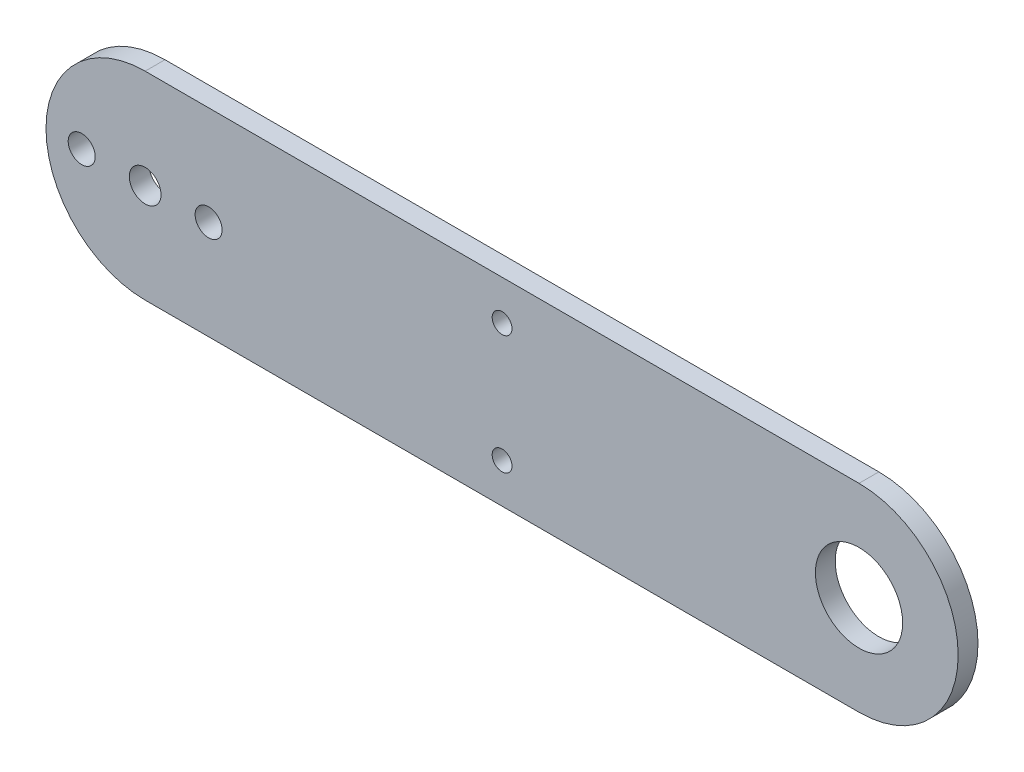
ISO-10303-21;
HEADER;
FILE_DESCRIPTION(('STEP AP214'),'2;1');
FILE_NAME('part.step','',(''),(''),'','','');
FILE_SCHEMA(('AUTOMOTIVE_DESIGN { 1 0 10303 214 1 1 1 1 }'));
ENDSEC;
DATA;
#1=APPLICATION_CONTEXT('core data for automotive mechanical design processes');
#2=APPLICATION_PROTOCOL_DEFINITION('international standard','automotive_design',2000,#1);
#3=PRODUCT_CONTEXT('',#1,'mechanical');
#4=PRODUCT('Part','Part','',(#3));
#5=PRODUCT_RELATED_PRODUCT_CATEGORY('part','',(#4));
#6=PRODUCT_DEFINITION_FORMATION('','',#4);
#7=PRODUCT_DEFINITION_CONTEXT('part definition',#1,'design');
#8=PRODUCT_DEFINITION('design','',#6,#7);
#9=PRODUCT_DEFINITION_SHAPE('','',#8);
#10=(LENGTH_UNIT() NAMED_UNIT(*) SI_UNIT(.MILLI.,.METRE.));
#11=(NAMED_UNIT(*) PLANE_ANGLE_UNIT() SI_UNIT($,.RADIAN.));
#12=(NAMED_UNIT(*) SI_UNIT($,.STERADIAN.) SOLID_ANGLE_UNIT());
#13=UNCERTAINTY_MEASURE_WITH_UNIT(LENGTH_MEASURE(1.E-05),#10,'distance_accuracy_value','');
#14=(GEOMETRIC_REPRESENTATION_CONTEXT(3) GLOBAL_UNCERTAINTY_ASSIGNED_CONTEXT((#13)) GLOBAL_UNIT_ASSIGNED_CONTEXT((#10,
#11,#12)) REPRESENTATION_CONTEXT('',''));
#15=CARTESIAN_POINT('',(0.,0.,0.));
#16=DIRECTION('',(0.,0.,1.));
#17=DIRECTION('',(1.,0.,0.));
#18=AXIS2_PLACEMENT_3D('',#15,#16,#17);
#19=CARTESIAN_POINT('',(0.,0.,5.));
#20=DIRECTION('',(0.,0.,1.));
#21=DIRECTION('',(1.,0.,0.));
#22=AXIS2_PLACEMENT_3D('',#19,#20,#21);
#23=PLANE('',#22);
#24=CARTESIAN_POINT('',(90.,15.,5.));
#25=DIRECTION('',(0.,0.,1.));
#26=DIRECTION('',(1.,0.,0.));
#27=AXIS2_PLACEMENT_3D('',#24,#25,#26);
#28=CIRCLE('',#27,2.5);
#29=CARTESIAN_POINT('',(92.5,15.,5.));
#30=VERTEX_POINT('',#29);
#31=EDGE_CURVE('E115',#30,#30,#28,.T.);
#32=ORIENTED_EDGE('',*,*,#31,.F.);
#33=EDGE_LOOP('',(#32));
#34=FACE_BOUND('',#33,.T.);
#35=CARTESIAN_POINT('',(90.,-15.,5.));
#36=DIRECTION('',(0.,0.,1.));
#37=DIRECTION('',(1.,0.,0.));
#38=AXIS2_PLACEMENT_3D('',#35,#36,#37);
#39=CIRCLE('',#38,2.5);
#40=CARTESIAN_POINT('',(92.5,-15.,5.));
#41=VERTEX_POINT('',#40);
#42=EDGE_CURVE('E121',#41,#41,#39,.T.);
#43=ORIENTED_EDGE('',*,*,#42,.F.);
#44=EDGE_LOOP('',(#43));
#45=FACE_BOUND('',#44,.T.);
#46=CARTESIAN_POINT('',(16.,0.,5.));
#47=DIRECTION('',(0.,0.,1.));
#48=DIRECTION('',(1.,0.,0.));
#49=AXIS2_PLACEMENT_3D('',#46,#47,#48);
#50=CIRCLE('',#49,3.4);
#51=CARTESIAN_POINT('',(19.4,0.,5.));
#52=VERTEX_POINT('',#51);
#53=EDGE_CURVE('E134',#52,#52,#50,.T.);
#54=ORIENTED_EDGE('',*,*,#53,.F.);
#55=EDGE_LOOP('',(#54));
#56=FACE_BOUND('',#55,.T.);
#57=CARTESIAN_POINT('',(0.,0.,5.));
#58=DIRECTION('',(0.,0.,1.));
#59=DIRECTION('',(1.,0.,0.));
#60=AXIS2_PLACEMENT_3D('',#57,#58,#59);
#61=CIRCLE('',#60,4.);
#62=CARTESIAN_POINT('',(4.,0.,5.));
#63=VERTEX_POINT('',#62);
#64=EDGE_CURVE('E108',#63,#63,#61,.T.);
#65=ORIENTED_EDGE('',*,*,#64,.F.);
#66=EDGE_LOOP('',(#65));
#67=FACE_BOUND('',#66,.T.);
#68=CARTESIAN_POINT('',(0.,0.,5.));
#69=DIRECTION('',(0.,0.,1.));
#70=DIRECTION('',(1.,0.,0.));
#71=AXIS2_PLACEMENT_3D('',#68,#69,#70);
#72=CIRCLE('',#71,25.);
#73=CARTESIAN_POINT('',(0.,25.,5.));
#74=VERTEX_POINT('',#73);
#75=CARTESIAN_POINT('',(0.,-25.,5.));
#76=VERTEX_POINT('',#75);
#77=EDGE_CURVE('E92',#74,#76,#72,.T.);
#78=ORIENTED_EDGE('',*,*,#77,.T.);
#79=DIRECTION('',(1.,0.,0.));
#80=VECTOR('',#79,1.);
#81=CARTESIAN_POINT('',(0.,-25.,5.));
#82=LINE('',#81,#80);
#83=CARTESIAN_POINT('',(180.,-25.,5.));
#84=VERTEX_POINT('',#83);
#85=EDGE_CURVE('E87',#76,#84,#82,.T.);
#86=ORIENTED_EDGE('',*,*,#85,.T.);
#87=CARTESIAN_POINT('',(180.,0.,5.));
#88=DIRECTION('',(0.,0.,1.));
#89=DIRECTION('',(1.,0.,0.));
#90=AXIS2_PLACEMENT_3D('',#87,#88,#89);
#91=CIRCLE('',#90,25.);
#92=CARTESIAN_POINT('',(180.,25.,5.));
#93=VERTEX_POINT('',#92);
#94=EDGE_CURVE('E90',#84,#93,#91,.T.);
#95=ORIENTED_EDGE('',*,*,#94,.T.);
#96=DIRECTION('',(-1.,0.,0.));
#97=VECTOR('',#96,1.);
#98=CARTESIAN_POINT('',(0.,25.,5.));
#99=LINE('',#98,#97);
#100=EDGE_CURVE('E57',#93,#74,#99,.T.);
#101=ORIENTED_EDGE('',*,*,#100,.T.);
#102=EDGE_LOOP('',(#78,#86,#95,#101));
#103=FACE_BOUND('',#102,.T.);
#104=CARTESIAN_POINT('',(-16.,0.,5.));
#105=DIRECTION('',(0.,0.,1.));
#106=DIRECTION('',(1.,0.,0.));
#107=AXIS2_PLACEMENT_3D('',#104,#105,#106);
#108=CIRCLE('',#107,3.4);
#109=CARTESIAN_POINT('',(-12.6,0.,5.));
#110=VERTEX_POINT('',#109);
#111=EDGE_CURVE('E140',#110,#110,#108,.T.);
#112=ORIENTED_EDGE('',*,*,#111,.F.);
#113=EDGE_LOOP('',(#112));
#114=FACE_BOUND('',#113,.T.);
#115=CARTESIAN_POINT('',(180.,0.,5.));
#116=DIRECTION('',(0.,0.,1.));
#117=DIRECTION('',(1.,0.,0.));
#118=AXIS2_PLACEMENT_3D('',#115,#116,#117);
#119=CIRCLE('',#118,11.);
#120=CARTESIAN_POINT('',(191.,0.,5.));
#121=VERTEX_POINT('',#120);
#122=EDGE_CURVE('E128',#121,#121,#119,.T.);
#123=ORIENTED_EDGE('',*,*,#122,.F.);
#124=EDGE_LOOP('',(#123));
#125=FACE_BOUND('',#124,.T.);
#126=ADVANCED_FACE('F38',(#34,#45,#56,#67,#103,#114,#125),#23,.T.);
#127=CARTESIAN_POINT('',(0.,0.,0.));
#128=DIRECTION('',(0.,0.,1.));
#129=DIRECTION('',(1.,0.,0.));
#130=AXIS2_PLACEMENT_3D('',#127,#128,#129);
#131=PLANE('',#130);
#132=CARTESIAN_POINT('',(90.,15.,0.));
#133=DIRECTION('',(0.,0.,1.));
#134=DIRECTION('',(1.,0.,0.));
#135=AXIS2_PLACEMENT_3D('',#132,#133,#134);
#136=CIRCLE('',#135,2.5);
#137=CARTESIAN_POINT('',(92.5,15.,0.));
#138=VERTEX_POINT('',#137);
#139=EDGE_CURVE('E42',#138,#138,#136,.T.);
#140=ORIENTED_EDGE('',*,*,#139,.T.);
#141=EDGE_LOOP('',(#140));
#142=FACE_BOUND('',#141,.T.);
#143=CARTESIAN_POINT('',(90.,-15.,0.));
#144=DIRECTION('',(0.,0.,1.));
#145=DIRECTION('',(1.,0.,0.));
#146=AXIS2_PLACEMENT_3D('',#143,#144,#145);
#147=CIRCLE('',#146,2.5);
#148=CARTESIAN_POINT('',(92.5,-15.,0.));
#149=VERTEX_POINT('',#148);
#150=EDGE_CURVE('E113',#149,#149,#147,.T.);
#151=ORIENTED_EDGE('',*,*,#150,.T.);
#152=EDGE_LOOP('',(#151));
#153=FACE_BOUND('',#152,.T.);
#154=CARTESIAN_POINT('',(0.,0.,0.));
#155=DIRECTION('',(0.,0.,1.));
#156=DIRECTION('',(1.,0.,0.));
#157=AXIS2_PLACEMENT_3D('',#154,#155,#156);
#158=CIRCLE('',#157,25.);
#159=CARTESIAN_POINT('',(0.,25.,0.));
#160=VERTEX_POINT('',#159);
#161=CARTESIAN_POINT('',(0.,-25.,0.));
#162=VERTEX_POINT('',#161);
#163=EDGE_CURVE('E105',#160,#162,#158,.T.);
#164=ORIENTED_EDGE('',*,*,#163,.F.);
#165=DIRECTION('',(-1.,0.,0.));
#166=VECTOR('',#165,1.);
#167=CARTESIAN_POINT('',(0.,25.,0.));
#168=LINE('',#167,#166);
#169=CARTESIAN_POINT('',(180.,25.,0.));
#170=VERTEX_POINT('',#169);
#171=EDGE_CURVE('E80',#170,#160,#168,.T.);
#172=ORIENTED_EDGE('',*,*,#171,.F.);
#173=CARTESIAN_POINT('',(180.,0.,0.));
#174=DIRECTION('',(0.,0.,1.));
#175=DIRECTION('',(1.,0.,0.));
#176=AXIS2_PLACEMENT_3D('',#173,#174,#175);
#177=CIRCLE('',#176,25.);
#178=CARTESIAN_POINT('',(180.,-25.,0.));
#179=VERTEX_POINT('',#178);
#180=EDGE_CURVE('E74',#179,#170,#177,.T.);
#181=ORIENTED_EDGE('',*,*,#180,.F.);
#182=DIRECTION('',(1.,0.,0.));
#183=VECTOR('',#182,1.);
#184=CARTESIAN_POINT('',(0.,-25.,0.));
#185=LINE('',#184,#183);
#186=EDGE_CURVE('E96',#162,#179,#185,.T.);
#187=ORIENTED_EDGE('',*,*,#186,.F.);
#188=EDGE_LOOP('',(#164,#172,#181,#187));
#189=FACE_BOUND('',#188,.T.);
#190=CARTESIAN_POINT('',(0.,0.,0.));
#191=DIRECTION('',(0.,0.,1.));
#192=DIRECTION('',(1.,0.,0.));
#193=AXIS2_PLACEMENT_3D('',#190,#191,#192);
#194=CIRCLE('',#193,4.);
#195=CARTESIAN_POINT('',(4.,0.,0.));
#196=VERTEX_POINT('',#195);
#197=EDGE_CURVE('E143',#196,#196,#194,.T.);
#198=ORIENTED_EDGE('',*,*,#197,.T.);
#199=EDGE_LOOP('',(#198));
#200=FACE_BOUND('',#199,.T.);
#201=CARTESIAN_POINT('',(-16.,0.,0.));
#202=DIRECTION('',(0.,0.,1.));
#203=DIRECTION('',(1.,0.,0.));
#204=AXIS2_PLACEMENT_3D('',#201,#202,#203);
#205=CIRCLE('',#204,3.4);
#206=CARTESIAN_POINT('',(-12.6,0.,0.));
#207=VERTEX_POINT('',#206);
#208=EDGE_CURVE('E137',#207,#207,#205,.T.);
#209=ORIENTED_EDGE('',*,*,#208,.T.);
#210=EDGE_LOOP('',(#209));
#211=FACE_BOUND('',#210,.T.);
#212=CARTESIAN_POINT('',(16.,0.,0.));
#213=DIRECTION('',(0.,0.,1.));
#214=DIRECTION('',(1.,0.,0.));
#215=AXIS2_PLACEMENT_3D('',#212,#213,#214);
#216=CIRCLE('',#215,3.4);
#217=CARTESIAN_POINT('',(19.4,0.,0.));
#218=VERTEX_POINT('',#217);
#219=EDGE_CURVE('E131',#218,#218,#216,.T.);
#220=ORIENTED_EDGE('',*,*,#219,.T.);
#221=EDGE_LOOP('',(#220));
#222=FACE_BOUND('',#221,.T.);
#223=CARTESIAN_POINT('',(180.,0.,0.));
#224=DIRECTION('',(0.,0.,1.));
#225=DIRECTION('',(1.,0.,0.));
#226=AXIS2_PLACEMENT_3D('',#223,#224,#225);
#227=CIRCLE('',#226,11.);
#228=CARTESIAN_POINT('',(191.,0.,0.));
#229=VERTEX_POINT('',#228);
#230=EDGE_CURVE('E119',#229,#229,#227,.T.);
#231=ORIENTED_EDGE('',*,*,#230,.T.);
#232=EDGE_LOOP('',(#231));
#233=FACE_BOUND('',#232,.T.);
#234=ADVANCED_FACE('F151',(#142,#153,#189,#200,#211,#222,#233),#131,.F.);
#235=CARTESIAN_POINT('',(0.,0.,5.));
#236=DIRECTION('',(0.,0.,-1.));
#237=DIRECTION('',(-1.,0.,0.));
#238=AXIS2_PLACEMENT_3D('',#235,#236,#237);
#239=CYLINDRICAL_SURFACE('',#238,25.);
#240=ORIENTED_EDGE('',*,*,#163,.T.);
#241=DIRECTION('',(0.,0.,-1.));
#242=VECTOR('',#241,1.);
#243=CARTESIAN_POINT('',(0.,-25.,5.));
#244=LINE('',#243,#242);
#245=EDGE_CURVE('E11',#76,#162,#244,.T.);
#246=ORIENTED_EDGE('',*,*,#245,.F.);
#247=ORIENTED_EDGE('',*,*,#77,.F.);
#248=DIRECTION('',(0.,0.,-1.));
#249=VECTOR('',#248,1.);
#250=CARTESIAN_POINT('',(0.,25.,5.));
#251=LINE('',#250,#249);
#252=EDGE_CURVE('E101',#74,#160,#251,.T.);
#253=ORIENTED_EDGE('',*,*,#252,.T.);
#254=EDGE_LOOP('',(#240,#246,#247,#253));
#255=FACE_BOUND('',#254,.T.);
#256=ADVANCED_FACE('F40',(#255),#239,.T.);
#257=CARTESIAN_POINT('',(0.,-25.,5.));
#258=DIRECTION('',(0.,1.,0.));
#259=DIRECTION('',(0.,0.,1.));
#260=AXIS2_PLACEMENT_3D('',#257,#258,#259);
#261=PLANE('',#260);
#262=ORIENTED_EDGE('',*,*,#186,.T.);
#263=DIRECTION('',(0.,0.,-1.));
#264=VECTOR('',#263,1.);
#265=CARTESIAN_POINT('',(180.,-25.,5.));
#266=LINE('',#265,#264);
#267=EDGE_CURVE('E48',#84,#179,#266,.T.);
#268=ORIENTED_EDGE('',*,*,#267,.F.);
#269=ORIENTED_EDGE('',*,*,#85,.F.);
#270=ORIENTED_EDGE('',*,*,#245,.T.);
#271=EDGE_LOOP('',(#262,#268,#269,#270));
#272=FACE_BOUND('',#271,.T.);
#273=ADVANCED_FACE('F95',(#272),#261,.F.);
#274=CARTESIAN_POINT('',(180.,0.,5.));
#275=DIRECTION('',(0.,0.,-1.));
#276=DIRECTION('',(-1.,0.,0.));
#277=AXIS2_PLACEMENT_3D('',#274,#275,#276);
#278=CYLINDRICAL_SURFACE('',#277,25.);
#279=ORIENTED_EDGE('',*,*,#180,.T.);
#280=DIRECTION('',(0.,0.,-1.));
#281=VECTOR('',#280,1.);
#282=CARTESIAN_POINT('',(180.,25.,5.));
#283=LINE('',#282,#281);
#284=EDGE_CURVE('E97',#93,#170,#283,.T.);
#285=ORIENTED_EDGE('',*,*,#284,.F.);
#286=ORIENTED_EDGE('',*,*,#94,.F.);
#287=ORIENTED_EDGE('',*,*,#267,.T.);
#288=EDGE_LOOP('',(#279,#285,#286,#287));
#289=FACE_BOUND('',#288,.T.);
#290=ADVANCED_FACE('F99',(#289),#278,.T.);
#291=CARTESIAN_POINT('',(0.,25.,5.));
#292=DIRECTION('',(0.,-1.,0.));
#293=DIRECTION('',(0.,0.,-1.));
#294=AXIS2_PLACEMENT_3D('',#291,#292,#293);
#295=PLANE('',#294);
#296=ORIENTED_EDGE('',*,*,#171,.T.);
#297=ORIENTED_EDGE('',*,*,#252,.F.);
#298=ORIENTED_EDGE('',*,*,#100,.F.);
#299=ORIENTED_EDGE('',*,*,#284,.T.);
#300=EDGE_LOOP('',(#296,#297,#298,#299));
#301=FACE_BOUND('',#300,.T.);
#302=ADVANCED_FACE('F157',(#301),#295,.F.);
#303=CARTESIAN_POINT('',(0.,0.,5.));
#304=DIRECTION('',(0.,0.,-1.));
#305=DIRECTION('',(-1.,0.,0.));
#306=AXIS2_PLACEMENT_3D('',#303,#304,#305);
#307=CYLINDRICAL_SURFACE('',#306,4.);
#308=ORIENTED_EDGE('',*,*,#64,.T.);
#309=EDGE_LOOP('',(#308));
#310=FACE_BOUND('',#309,.T.);
#311=ORIENTED_EDGE('',*,*,#197,.F.);
#312=EDGE_LOOP('',(#311));
#313=FACE_BOUND('',#312,.T.);
#314=ADVANCED_FACE('F154',(#310,#313),#307,.F.);
#315=CARTESIAN_POINT('',(-16.,0.,5.));
#316=DIRECTION('',(0.,0.,-1.));
#317=DIRECTION('',(-1.,0.,0.));
#318=AXIS2_PLACEMENT_3D('',#315,#316,#317);
#319=CYLINDRICAL_SURFACE('',#318,3.4);
#320=ORIENTED_EDGE('',*,*,#111,.T.);
#321=EDGE_LOOP('',(#320));
#322=FACE_BOUND('',#321,.T.);
#323=ORIENTED_EDGE('',*,*,#208,.F.);
#324=EDGE_LOOP('',(#323));
#325=FACE_BOUND('',#324,.T.);
#326=ADVANCED_FACE('F156',(#322,#325),#319,.F.);
#327=CARTESIAN_POINT('',(16.,0.,5.));
#328=DIRECTION('',(0.,0.,-1.));
#329=DIRECTION('',(-1.,0.,0.));
#330=AXIS2_PLACEMENT_3D('',#327,#328,#329);
#331=CYLINDRICAL_SURFACE('',#330,3.4);
#332=ORIENTED_EDGE('',*,*,#53,.T.);
#333=EDGE_LOOP('',(#332));
#334=FACE_BOUND('',#333,.T.);
#335=ORIENTED_EDGE('',*,*,#219,.F.);
#336=EDGE_LOOP('',(#335));
#337=FACE_BOUND('',#336,.T.);
#338=ADVANCED_FACE('F164',(#334,#337),#331,.F.);
#339=CARTESIAN_POINT('',(180.,0.,5.));
#340=DIRECTION('',(0.,0.,-1.));
#341=DIRECTION('',(-1.,0.,0.));
#342=AXIS2_PLACEMENT_3D('',#339,#340,#341);
#343=CYLINDRICAL_SURFACE('',#342,11.);
#344=ORIENTED_EDGE('',*,*,#122,.T.);
#345=EDGE_LOOP('',(#344));
#346=FACE_BOUND('',#345,.T.);
#347=ORIENTED_EDGE('',*,*,#230,.F.);
#348=EDGE_LOOP('',(#347));
#349=FACE_BOUND('',#348,.T.);
#350=ADVANCED_FACE('F208',(#346,#349),#343,.F.);
#351=CARTESIAN_POINT('',(90.,-15.,-5.));
#352=DIRECTION('',(0.,0.,1.));
#353=DIRECTION('',(1.,0.,0.));
#354=AXIS2_PLACEMENT_3D('',#351,#352,#353);
#355=CYLINDRICAL_SURFACE('',#354,2.5);
#356=ORIENTED_EDGE('',*,*,#42,.T.);
#357=EDGE_LOOP('',(#356));
#358=FACE_BOUND('',#357,.T.);
#359=ORIENTED_EDGE('',*,*,#150,.F.);
#360=EDGE_LOOP('',(#359));
#361=FACE_BOUND('',#360,.T.);
#362=ADVANCED_FACE('F202',(#358,#361),#355,.F.);
#363=CARTESIAN_POINT('',(90.,15.,-5.));
#364=DIRECTION('',(0.,0.,1.));
#365=DIRECTION('',(1.,0.,0.));
#366=AXIS2_PLACEMENT_3D('',#363,#364,#365);
#367=CYLINDRICAL_SURFACE('',#366,2.5);
#368=ORIENTED_EDGE('',*,*,#31,.T.);
#369=EDGE_LOOP('',(#368));
#370=FACE_BOUND('',#369,.T.);
#371=ORIENTED_EDGE('',*,*,#139,.F.);
#372=EDGE_LOOP('',(#371));
#373=FACE_BOUND('',#372,.T.);
#374=ADVANCED_FACE('F207',(#370,#373),#367,.F.);
#375=CLOSED_SHELL('',(#126,#234,#256,#273,#290,#302,#314,#326,#338,#350,#362,#374));
#376=MANIFOLD_SOLID_BREP('B2',#375);
#377=ADVANCED_BREP_SHAPE_REPRESENTATION('',(#18,#376),#14);
#378=SHAPE_DEFINITION_REPRESENTATION(#9,#377);
ENDSEC;
END-ISO-10303-21;
